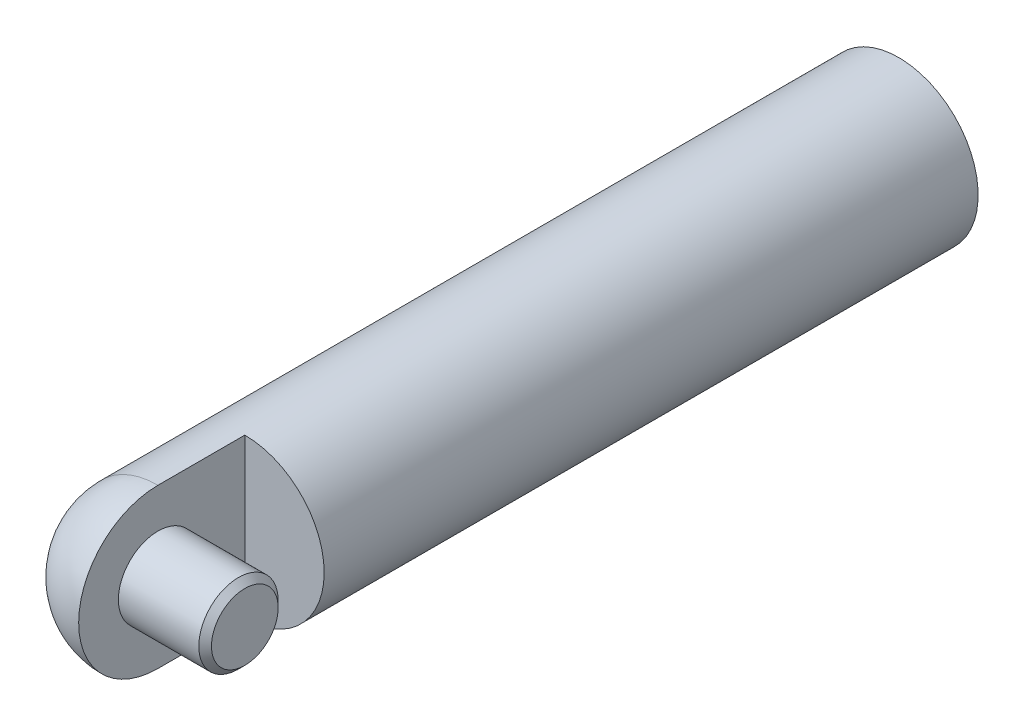
ISO-10303-21;
HEADER;
FILE_DESCRIPTION(('STEP AP214'),'2;1');
FILE_NAME('part.step','',(''),(''),'','','');
FILE_SCHEMA(('AUTOMOTIVE_DESIGN { 1 0 10303 214 1 1 1 1 }'));
ENDSEC;
DATA;
#1=APPLICATION_CONTEXT('core data for automotive mechanical design processes');
#2=APPLICATION_PROTOCOL_DEFINITION('international standard','automotive_design',2000,#1);
#3=PRODUCT_CONTEXT('',#1,'mechanical');
#4=PRODUCT('Part','Part','',(#3));
#5=PRODUCT_RELATED_PRODUCT_CATEGORY('part','',(#4));
#6=PRODUCT_DEFINITION_FORMATION('','',#4);
#7=PRODUCT_DEFINITION_CONTEXT('part definition',#1,'design');
#8=PRODUCT_DEFINITION('design','',#6,#7);
#9=PRODUCT_DEFINITION_SHAPE('','',#8);
#10=(LENGTH_UNIT() NAMED_UNIT(*) SI_UNIT(.MILLI.,.METRE.));
#11=(NAMED_UNIT(*) PLANE_ANGLE_UNIT() SI_UNIT($,.RADIAN.));
#12=(NAMED_UNIT(*) SI_UNIT($,.STERADIAN.) SOLID_ANGLE_UNIT());
#13=UNCERTAINTY_MEASURE_WITH_UNIT(LENGTH_MEASURE(1.E-05),#10,'distance_accuracy_value','');
#14=(GEOMETRIC_REPRESENTATION_CONTEXT(3) GLOBAL_UNCERTAINTY_ASSIGNED_CONTEXT((#13)) GLOBAL_UNIT_ASSIGNED_CONTEXT((#10,
#11,#12)) REPRESENTATION_CONTEXT('',''));
#15=CARTESIAN_POINT('',(0.,0.,0.));
#16=DIRECTION('',(0.,0.,1.));
#17=DIRECTION('',(1.,0.,0.));
#18=AXIS2_PLACEMENT_3D('',#15,#16,#17);
#19=CARTESIAN_POINT('',(0.,0.,0.));
#20=DIRECTION('',(0.,0.,-1.));
#21=DIRECTION('',(-1.,0.,0.));
#22=AXIS2_PLACEMENT_3D('',#19,#20,#21);
#23=CYLINDRICAL_SURFACE('',#22,19.05);
#24=CARTESIAN_POINT('',(0.,0.,0.));
#25=DIRECTION('',(0.,0.,-1.));
#26=DIRECTION('',(-1.,0.,0.));
#27=AXIS2_PLACEMENT_3D('',#24,#25,#26);
#28=CIRCLE('',#27,19.05);
#29=CARTESIAN_POINT('',(-19.05,0.,0.));
#30=VERTEX_POINT('',#29);
#31=EDGE_CURVE('E97',#30,#30,#28,.T.);
#32=ORIENTED_EDGE('',*,*,#31,.F.);
#33=EDGE_LOOP('',(#32));
#34=FACE_BOUND('',#33,.T.);
#35=CARTESIAN_POINT('',(0.,0.,156.972));
#36=DIRECTION('',(0.,0.,1.));
#37=DIRECTION('',(1.,0.,0.));
#38=AXIS2_PLACEMENT_3D('',#35,#36,#37);
#39=CIRCLE('',#38,19.05);
#40=CARTESIAN_POINT('',(0.,-19.05,156.972));
#41=VERTEX_POINT('',#40);
#42=CARTESIAN_POINT('',(0.,19.05,156.972));
#43=VERTEX_POINT('',#42);
#44=EDGE_CURVE('E75',#41,#43,#39,.T.);
#45=ORIENTED_EDGE('',*,*,#44,.F.);
#46=DIRECTION('',(0.,0.,-1.));
#47=VECTOR('',#46,1.);
#48=CARTESIAN_POINT('',(0.,-19.05,0.));
#49=LINE('',#48,#47);
#50=CARTESIAN_POINT('',(0.,-19.05,177.8));
#51=VERTEX_POINT('',#50);
#52=EDGE_CURVE('E83',#51,#41,#49,.T.);
#53=ORIENTED_EDGE('',*,*,#52,.F.);
#54=CARTESIAN_POINT('',(0.,0.,177.8));
#55=DIRECTION('',(0.,0.,-1.));
#56=DIRECTION('',(-1.,0.,0.));
#57=AXIS2_PLACEMENT_3D('',#54,#55,#56);
#58=CIRCLE('',#57,19.05);
#59=CARTESIAN_POINT('',(0.,19.05,177.8));
#60=VERTEX_POINT('',#59);
#61=EDGE_CURVE('E91',#51,#60,#58,.T.);
#62=ORIENTED_EDGE('',*,*,#61,.T.);
#63=DIRECTION('',(0.,0.,1.));
#64=VECTOR('',#63,1.);
#65=CARTESIAN_POINT('',(0.,19.05,0.));
#66=LINE('',#65,#64);
#67=EDGE_CURVE('E68',#43,#60,#66,.T.);
#68=ORIENTED_EDGE('',*,*,#67,.F.);
#69=EDGE_LOOP('',(#45,#53,#62,#68));
#70=FACE_BOUND('',#69,.T.);
#71=ADVANCED_FACE('F51',(#34,#70),#23,.T.);
#72=CARTESIAN_POINT('',(0.,0.,177.8));
#73=DIRECTION('',(0.,0.,-1.));
#74=DIRECTION('',(0.,-1.,0.));
#75=AXIS2_PLACEMENT_3D('',#72,#73,#74);
#76=SPHERICAL_SURFACE('',#75,19.05);
#77=CARTESIAN_POINT('',(0.,0.,177.8));
#78=DIRECTION('',(1.,0.,0.));
#79=DIRECTION('',(0.,0.,-1.));
#80=AXIS2_PLACEMENT_3D('',#77,#78,#79);
#81=CIRCLE('',#80,19.05);
#82=EDGE_CURVE('E80',#60,#51,#81,.T.);
#83=ORIENTED_EDGE('',*,*,#82,.F.);
#84=ORIENTED_EDGE('',*,*,#61,.F.);
#85=EDGE_LOOP('',(#83,#84));
#86=FACE_BOUND('',#85,.T.);
#87=ADVANCED_FACE('F95',(#86),#76,.T.);
#88=CARTESIAN_POINT('',(0.,0.,0.));
#89=DIRECTION('',(0.,0.,1.));
#90=DIRECTION('',(1.,0.,0.));
#91=AXIS2_PLACEMENT_3D('',#88,#89,#90);
#92=PLANE('',#91);
#93=ORIENTED_EDGE('',*,*,#31,.T.);
#94=EDGE_LOOP('',(#93));
#95=FACE_BOUND('',#94,.T.);
#96=ADVANCED_FACE('F128',(#95),#92,.F.);
#97=CARTESIAN_POINT('',(19.05,0.,156.972));
#98=DIRECTION('',(0.,0.,1.));
#99=DIRECTION('',(1.,0.,0.));
#100=AXIS2_PLACEMENT_3D('',#97,#98,#99);
#101=PLANE('',#100);
#102=ORIENTED_EDGE('',*,*,#44,.T.);
#103=DIRECTION('',(0.,1.,0.));
#104=VECTOR('',#103,1.);
#105=CARTESIAN_POINT('',(0.,0.,156.972));
#106=LINE('',#105,#104);
#107=EDGE_CURVE('E93',#41,#43,#106,.T.);
#108=ORIENTED_EDGE('',*,*,#107,.F.);
#109=EDGE_LOOP('',(#102,#108));
#110=FACE_BOUND('',#109,.T.);
#111=ADVANCED_FACE('F132',(#110),#101,.T.);
#112=CARTESIAN_POINT('',(0.,0.,0.));
#113=DIRECTION('',(1.,0.,0.));
#114=DIRECTION('',(0.,0.,-1.));
#115=AXIS2_PLACEMENT_3D('',#112,#113,#114);
#116=PLANE('',#115);
#117=CARTESIAN_POINT('',(0.,0.,177.8));
#118=DIRECTION('',(1.,0.,0.));
#119=DIRECTION('',(0.,0.,-1.));
#120=AXIS2_PLACEMENT_3D('',#117,#118,#119);
#121=CIRCLE('',#120,9.525);
#122=CARTESIAN_POINT('',(0.,0.,168.275));
#123=VERTEX_POINT('',#122);
#124=EDGE_CURVE('E88',#123,#123,#121,.T.);
#125=ORIENTED_EDGE('',*,*,#124,.F.);
#126=EDGE_LOOP('',(#125));
#127=FACE_BOUND('',#126,.T.);
#128=ORIENTED_EDGE('',*,*,#82,.T.);
#129=ORIENTED_EDGE('',*,*,#52,.T.);
#130=ORIENTED_EDGE('',*,*,#107,.T.);
#131=ORIENTED_EDGE('',*,*,#67,.T.);
#132=EDGE_LOOP('',(#128,#129,#130,#131));
#133=FACE_BOUND('',#132,.T.);
#134=ADVANCED_FACE('F82',(#127,#133),#116,.T.);
#135=CARTESIAN_POINT('',(20.828,0.,177.8));
#136=DIRECTION('',(-1.,0.,0.));
#137=DIRECTION('',(0.,0.,1.));
#138=AXIS2_PLACEMENT_3D('',#135,#136,#137);
#139=CYLINDRICAL_SURFACE('',#138,9.525);
#140=CARTESIAN_POINT('',(19.304,0.,177.8));
#141=DIRECTION('',(1.,0.,0.));
#142=DIRECTION('',(0.,0.,-1.));
#143=AXIS2_PLACEMENT_3D('',#140,#141,#142);
#144=CIRCLE('',#143,9.525);
#145=CARTESIAN_POINT('',(19.304,0.,168.275));
#146=VERTEX_POINT('',#145);
#147=EDGE_CURVE('E11',#146,#146,#144,.F.);
#148=ORIENTED_EDGE('',*,*,#147,.T.);
#149=EDGE_LOOP('',(#148));
#150=FACE_BOUND('',#149,.T.);
#151=ORIENTED_EDGE('',*,*,#124,.T.);
#152=EDGE_LOOP('',(#151));
#153=FACE_BOUND('',#152,.T.);
#154=ADVANCED_FACE('F118',(#150,#153),#139,.T.);
#155=CARTESIAN_POINT('',(20.828,0.,0.));
#156=DIRECTION('',(1.,0.,0.));
#157=DIRECTION('',(0.,0.,-1.));
#158=AXIS2_PLACEMENT_3D('',#155,#156,#157);
#159=PLANE('',#158);
#160=CARTESIAN_POINT('',(20.828,0.,177.8));
#161=DIRECTION('',(1.,0.,0.));
#162=DIRECTION('',(0.,0.,-1.));
#163=AXIS2_PLACEMENT_3D('',#160,#161,#162);
#164=CIRCLE('',#163,8.00099999999998);
#165=CARTESIAN_POINT('',(20.828,0.,169.799));
#166=VERTEX_POINT('',#165);
#167=EDGE_CURVE('E61',#166,#166,#164,.T.);
#168=ORIENTED_EDGE('',*,*,#167,.T.);
#169=EDGE_LOOP('',(#168));
#170=FACE_BOUND('',#169,.T.);
#171=ADVANCED_FACE('F111',(#170),#159,.T.);
#172=CARTESIAN_POINT('',(20.828,0.,177.8));
#173=DIRECTION('',(-1.,0.,0.));
#174=DIRECTION('',(0.,0.,1.));
#175=AXIS2_PLACEMENT_3D('',#172,#173,#174);
#176=CONICAL_SURFACE('',#175,8.00099999999998,0.78539816339745);
#177=ORIENTED_EDGE('',*,*,#147,.F.);
#178=EDGE_LOOP('',(#177));
#179=FACE_BOUND('',#178,.T.);
#180=ORIENTED_EDGE('',*,*,#167,.F.);
#181=EDGE_LOOP('',(#180));
#182=FACE_BOUND('',#181,.T.);
#183=ADVANCED_FACE('F54',(#179,#182),#176,.T.);
#184=CLOSED_SHELL('',(#71,#87,#96,#111,#134,#154,#171,#183));
#185=MANIFOLD_SOLID_BREP('B2',#184);
#186=ADVANCED_BREP_SHAPE_REPRESENTATION('',(#18,#185),#14);
#187=SHAPE_DEFINITION_REPRESENTATION(#9,#186);
ENDSEC;
END-ISO-10303-21;
